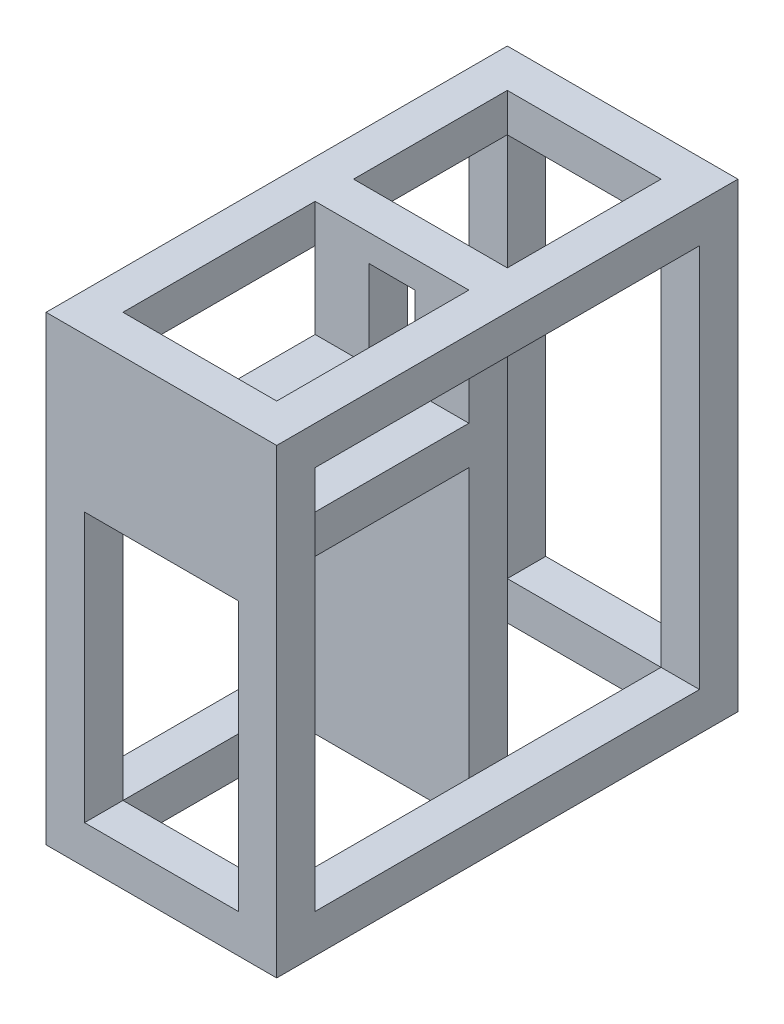
ISO-10303-21;
HEADER;
FILE_DESCRIPTION(('STEP AP214'),'2;1');
FILE_NAME('part.step','',(''),(''),'','','');
FILE_SCHEMA(('AUTOMOTIVE_DESIGN { 1 0 10303 214 1 1 1 1 }'));
ENDSEC;
DATA;
#1=APPLICATION_CONTEXT('core data for automotive mechanical design processes');
#2=APPLICATION_PROTOCOL_DEFINITION('international standard','automotive_design',2000,#1);
#3=PRODUCT_CONTEXT('',#1,'mechanical');
#4=PRODUCT('Part','Part','',(#3));
#5=PRODUCT_RELATED_PRODUCT_CATEGORY('part','',(#4));
#6=PRODUCT_DEFINITION_FORMATION('','',#4);
#7=PRODUCT_DEFINITION_CONTEXT('part definition',#1,'design');
#8=PRODUCT_DEFINITION('design','',#6,#7);
#9=PRODUCT_DEFINITION_SHAPE('','',#8);
#10=(LENGTH_UNIT() NAMED_UNIT(*) SI_UNIT(.MILLI.,.METRE.));
#11=(NAMED_UNIT(*) PLANE_ANGLE_UNIT() SI_UNIT($,.RADIAN.));
#12=(NAMED_UNIT(*) SI_UNIT($,.STERADIAN.) SOLID_ANGLE_UNIT());
#13=UNCERTAINTY_MEASURE_WITH_UNIT(LENGTH_MEASURE(1.E-05),#10,'distance_accuracy_value','');
#14=(GEOMETRIC_REPRESENTATION_CONTEXT(3) GLOBAL_UNCERTAINTY_ASSIGNED_CONTEXT((#13)) GLOBAL_UNIT_ASSIGNED_CONTEXT((#10,
#11,#12)) REPRESENTATION_CONTEXT('',''));
#15=CARTESIAN_POINT('',(0.,0.,0.));
#16=DIRECTION('',(0.,0.,1.));
#17=DIRECTION('',(1.,0.,0.));
#18=AXIS2_PLACEMENT_3D('',#15,#16,#17);
#19=CARTESIAN_POINT('',(50.8,304.8,-127.));
#20=DIRECTION('',(-1.,0.,0.));
#21=DIRECTION('',(0.,0.,1.));
#22=AXIS2_PLACEMENT_3D('',#19,#20,#21);
#23=PLANE('',#22);
#24=DIRECTION('',(0.,-1.,0.));
#25=VECTOR('',#24,1.);
#26=CARTESIAN_POINT('',(50.8,279.4,152.4));
#27=LINE('',#26,#25);
#28=CARTESIAN_POINT('',(50.8,203.2,152.4));
#29=VERTEX_POINT('',#28);
#30=CARTESIAN_POINT('',(50.8,25.4,152.4));
#31=VERTEX_POINT('',#30);
#32=EDGE_CURVE('E422',#29,#31,#27,.T.);
#33=ORIENTED_EDGE('',*,*,#32,.F.);
#34=DIRECTION('',(0.,0.,-1.));
#35=VECTOR('',#34,1.);
#36=CARTESIAN_POINT('',(50.8,203.2,152.4));
#37=LINE('',#36,#35);
#38=CARTESIAN_POINT('',(50.8,203.2,127.));
#39=VERTEX_POINT('',#38);
#40=EDGE_CURVE('E550',#29,#39,#37,.T.);
#41=ORIENTED_EDGE('',*,*,#40,.T.);
#42=DIRECTION('',(0.,1.,0.));
#43=VECTOR('',#42,1.);
#44=CARTESIAN_POINT('',(50.8,304.8,127.));
#45=LINE('',#44,#43);
#46=CARTESIAN_POINT('',(50.8,25.4,127.));
#47=VERTEX_POINT('',#46);
#48=EDGE_CURVE('E390',#47,#39,#45,.T.);
#49=ORIENTED_EDGE('',*,*,#48,.F.);
#50=DIRECTION('',(0.,0.,1.));
#51=VECTOR('',#50,1.);
#52=CARTESIAN_POINT('',(50.8,25.4,-152.4));
#53=LINE('',#52,#51);
#54=EDGE_CURVE('E419',#47,#31,#53,.T.);
#55=ORIENTED_EDGE('',*,*,#54,.T.);
#56=EDGE_LOOP('',(#33,#41,#49,#55));
#57=FACE_BOUND('',#56,.T.);
#58=ADVANCED_FACE('F44',(#57),#23,.T.);
#59=CARTESIAN_POINT('',(-50.8,304.8,-127.));
#60=DIRECTION('',(1.,0.,0.));
#61=DIRECTION('',(0.,0.,-1.));
#62=AXIS2_PLACEMENT_3D('',#59,#60,#61);
#63=PLANE('',#62);
#64=DIRECTION('',(0.,-1.,0.));
#65=VECTOR('',#64,1.);
#66=CARTESIAN_POINT('',(-50.8,304.8,127.));
#67=LINE('',#66,#65);
#68=CARTESIAN_POINT('',(-50.8,203.2,127.));
#69=VERTEX_POINT('',#68);
#70=CARTESIAN_POINT('',(-50.8,25.4,127.));
#71=VERTEX_POINT('',#70);
#72=EDGE_CURVE('E388',#69,#71,#67,.T.);
#73=ORIENTED_EDGE('',*,*,#72,.F.);
#74=DIRECTION('',(0.,0.,-1.));
#75=VECTOR('',#74,1.);
#76=CARTESIAN_POINT('',(-50.8,203.2,152.4));
#77=LINE('',#76,#75);
#78=CARTESIAN_POINT('',(-50.8,203.2,152.4));
#79=VERTEX_POINT('',#78);
#80=EDGE_CURVE('E305',#79,#69,#77,.T.);
#81=ORIENTED_EDGE('',*,*,#80,.F.);
#82=DIRECTION('',(0.,-1.,0.));
#83=VECTOR('',#82,1.);
#84=CARTESIAN_POINT('',(-50.8,279.4,152.4));
#85=LINE('',#84,#83);
#86=CARTESIAN_POINT('',(-50.8,25.4,152.4));
#87=VERTEX_POINT('',#86);
#88=EDGE_CURVE('E411',#79,#87,#85,.T.);
#89=ORIENTED_EDGE('',*,*,#88,.T.);
#90=DIRECTION('',(0.,0.,1.));
#91=VECTOR('',#90,1.);
#92=CARTESIAN_POINT('',(-50.8,25.4,-152.4));
#93=LINE('',#92,#91);
#94=EDGE_CURVE('E429',#71,#87,#93,.T.);
#95=ORIENTED_EDGE('',*,*,#94,.F.);
#96=EDGE_LOOP('',(#73,#81,#89,#95));
#97=FACE_BOUND('',#96,.T.);
#98=ADVANCED_FACE('F593',(#97),#63,.T.);
#99=CARTESIAN_POINT('',(0.,304.8,0.));
#100=DIRECTION('',(0.,0.,1.));
#101=DIRECTION('',(1.,0.,0.));
#102=AXIS2_PLACEMENT_3D('',#99,#100,#101);
#103=PLANE('',#102);
#104=DIRECTION('',(0.,1.,0.));
#105=VECTOR('',#104,1.);
#106=CARTESIAN_POINT('',(15.24,287.02,0.));
#107=LINE('',#106,#105);
#108=CARTESIAN_POINT('',(15.24,228.6,0.));
#109=VERTEX_POINT('',#108);
#110=CARTESIAN_POINT('',(15.24,287.02,0.));
#111=VERTEX_POINT('',#110);
#112=EDGE_CURVE('E288',#109,#111,#107,.T.);
#113=ORIENTED_EDGE('',*,*,#112,.F.);
#114=DIRECTION('',(-1.,0.,0.));
#115=VECTOR('',#114,1.);
#116=CARTESIAN_POINT('',(-50.8,228.6,0.));
#117=LINE('',#116,#115);
#118=CARTESIAN_POINT('',(50.8,228.6,0.));
#119=VERTEX_POINT('',#118);
#120=EDGE_CURVE('E547',#119,#109,#117,.T.);
#121=ORIENTED_EDGE('',*,*,#120,.F.);
#122=DIRECTION('',(0.,-1.,0.));
#123=VECTOR('',#122,1.);
#124=CARTESIAN_POINT('',(50.8,304.8,0.));
#125=LINE('',#124,#123);
#126=CARTESIAN_POINT('',(50.8,279.4,0.));
#127=VERTEX_POINT('',#126);
#128=EDGE_CURVE('E336',#127,#119,#125,.T.);
#129=ORIENTED_EDGE('',*,*,#128,.F.);
#130=CARTESIAN_POINT('',(50.8,304.8,0.));
#131=VERTEX_POINT('',#130);
#132=EDGE_CURVE('E332',#131,#127,#125,.T.);
#133=ORIENTED_EDGE('',*,*,#132,.F.);
#134=DIRECTION('',(-1.,0.,0.));
#135=VECTOR('',#134,1.);
#136=CARTESIAN_POINT('',(0.,304.8,0.));
#137=LINE('',#136,#135);
#138=CARTESIAN_POINT('',(-50.8,304.8,0.));
#139=VERTEX_POINT('',#138);
#140=EDGE_CURVE('E315',#131,#139,#137,.T.);
#141=ORIENTED_EDGE('',*,*,#140,.T.);
#142=DIRECTION('',(0.,-1.,0.));
#143=VECTOR('',#142,1.);
#144=CARTESIAN_POINT('',(-50.8,304.8,0.));
#145=LINE('',#144,#143);
#146=CARTESIAN_POINT('',(-50.8,279.4,0.));
#147=VERTEX_POINT('',#146);
#148=EDGE_CURVE('E328',#139,#147,#145,.T.);
#149=ORIENTED_EDGE('',*,*,#148,.T.);
#150=CARTESIAN_POINT('',(-50.8,228.6,0.));
#151=VERTEX_POINT('',#150);
#152=EDGE_CURVE('E330',#147,#151,#145,.T.);
#153=ORIENTED_EDGE('',*,*,#152,.T.);
#154=CARTESIAN_POINT('',(-15.24,228.6,0.));
#155=VERTEX_POINT('',#154);
#156=EDGE_CURVE('E304',#155,#151,#117,.T.);
#157=ORIENTED_EDGE('',*,*,#156,.F.);
#158=DIRECTION('',(0.,-1.,0.));
#159=VECTOR('',#158,1.);
#160=CARTESIAN_POINT('',(-15.24,287.02,0.));
#161=LINE('',#160,#159);
#162=CARTESIAN_POINT('',(-15.24,287.02,0.));
#163=VERTEX_POINT('',#162);
#164=EDGE_CURVE('E66',#163,#155,#161,.T.);
#165=ORIENTED_EDGE('',*,*,#164,.F.);
#166=DIRECTION('',(-1.,0.,0.));
#167=VECTOR('',#166,1.);
#168=CARTESIAN_POINT('',(-15.24,287.02,0.));
#169=LINE('',#168,#167);
#170=EDGE_CURVE('E1268',#111,#163,#169,.T.);
#171=ORIENTED_EDGE('',*,*,#170,.F.);
#172=EDGE_LOOP('',(#113,#121,#129,#133,#141,#149,#153,#157,#165,#171));
#173=FACE_BOUND('',#172,.T.);
#174=ADVANCED_FACE('F676',(#173),#103,.T.);
#175=CARTESIAN_POINT('',(50.8,203.2,0.));
#176=VERTEX_POINT('',#175);
#177=CARTESIAN_POINT('',(50.8,25.4000000000001,0.));
#178=VERTEX_POINT('',#177);
#179=EDGE_CURVE('E337',#176,#178,#125,.T.);
#180=ORIENTED_EDGE('',*,*,#179,.F.);
#181=DIRECTION('',(1.,0.,0.));
#182=VECTOR('',#181,1.);
#183=CARTESIAN_POINT('',(-50.8,203.2,0.));
#184=LINE('',#183,#182);
#185=CARTESIAN_POINT('',(-50.8,203.2,0.));
#186=VERTEX_POINT('',#185);
#187=EDGE_CURVE('E546',#186,#176,#184,.T.);
#188=ORIENTED_EDGE('',*,*,#187,.F.);
#189=CARTESIAN_POINT('',(-50.8,25.4000000000001,0.));
#190=VERTEX_POINT('',#189);
#191=EDGE_CURVE('E331',#186,#190,#145,.T.);
#192=ORIENTED_EDGE('',*,*,#191,.T.);
#193=CARTESIAN_POINT('',(-50.8,0.,0.));
#194=VERTEX_POINT('',#193);
#195=EDGE_CURVE('E335',#190,#194,#145,.T.);
#196=ORIENTED_EDGE('',*,*,#195,.T.);
#197=DIRECTION('',(-1.,0.,0.));
#198=VECTOR('',#197,1.);
#199=CARTESIAN_POINT('',(0.,0.,0.));
#200=LINE('',#199,#198);
#201=CARTESIAN_POINT('',(50.8,0.,0.));
#202=VERTEX_POINT('',#201);
#203=EDGE_CURVE('E316',#202,#194,#200,.T.);
#204=ORIENTED_EDGE('',*,*,#203,.F.);
#205=EDGE_CURVE('E340',#178,#202,#125,.T.);
#206=ORIENTED_EDGE('',*,*,#205,.F.);
#207=EDGE_LOOP('',(#180,#188,#192,#196,#204,#206));
#208=FACE_BOUND('',#207,.T.);
#209=ADVANCED_FACE('F566',(#208),#103,.T.);
#210=DIRECTION('',(0.,0.,-1.));
#211=VECTOR('',#210,1.);
#212=CARTESIAN_POINT('',(50.8,0.,-127.));
#213=LINE('',#212,#211);
#214=CARTESIAN_POINT('',(50.8,0.,-25.4));
#215=VERTEX_POINT('',#214);
#216=CARTESIAN_POINT('',(50.8,0.,-127.));
#217=VERTEX_POINT('',#216);
#218=EDGE_CURVE('E444',#215,#217,#213,.T.);
#219=ORIENTED_EDGE('',*,*,#218,.F.);
#220=DIRECTION('',(0.,-1.,0.));
#221=VECTOR('',#220,1.);
#222=CARTESIAN_POINT('',(50.8,304.8,-25.4));
#223=LINE('',#222,#221);
#224=CARTESIAN_POINT('',(50.8,25.4000000000001,-25.4));
#225=VERTEX_POINT('',#224);
#226=EDGE_CURVE('E318',#225,#215,#223,.T.);
#227=ORIENTED_EDGE('',*,*,#226,.F.);
#228=DIRECTION('',(0.,0.,1.));
#229=VECTOR('',#228,1.);
#230=CARTESIAN_POINT('',(50.8,25.4000000000001,-127.));
#231=LINE('',#230,#229);
#232=CARTESIAN_POINT('',(50.7999999999999,25.4,-127.));
#233=VERTEX_POINT('',#232);
#234=EDGE_CURVE('E398',#233,#225,#231,.T.);
#235=ORIENTED_EDGE('',*,*,#234,.F.);
#236=DIRECTION('',(0.,-1.,0.));
#237=VECTOR('',#236,1.);
#238=CARTESIAN_POINT('',(50.8,304.8,-127.));
#239=LINE('',#238,#237);
#240=EDGE_CURVE('E481',#233,#217,#239,.T.);
#241=ORIENTED_EDGE('',*,*,#240,.T.);
#242=EDGE_LOOP('',(#219,#227,#235,#241));
#243=FACE_BOUND('',#242,.T.);
#244=ADVANCED_FACE('F614',(#243),#23,.T.);
#245=DIRECTION('',(0.,0.,-1.));
#246=VECTOR('',#245,1.);
#247=CARTESIAN_POINT('',(-50.8,25.4000000000001,-127.));
#248=LINE('',#247,#246);
#249=CARTESIAN_POINT('',(-50.8,25.4000000000001,-25.4));
#250=VERTEX_POINT('',#249);
#251=CARTESIAN_POINT('',(-50.8,25.4,-127.));
#252=VERTEX_POINT('',#251);
#253=EDGE_CURVE('E392',#250,#252,#248,.T.);
#254=ORIENTED_EDGE('',*,*,#253,.F.);
#255=DIRECTION('',(0.,-1.,0.));
#256=VECTOR('',#255,1.);
#257=CARTESIAN_POINT('',(-50.8,304.8,-25.4));
#258=LINE('',#257,#256);
#259=CARTESIAN_POINT('',(-50.8,0.,-25.4));
#260=VERTEX_POINT('',#259);
#261=EDGE_CURVE('E327',#250,#260,#258,.T.);
#262=ORIENTED_EDGE('',*,*,#261,.T.);
#263=DIRECTION('',(0.,0.,1.));
#264=VECTOR('',#263,1.);
#265=CARTESIAN_POINT('',(-50.8,0.,-127.));
#266=LINE('',#265,#264);
#267=CARTESIAN_POINT('',(-50.8,0.,-127.));
#268=VERTEX_POINT('',#267);
#269=EDGE_CURVE('E465',#268,#260,#266,.T.);
#270=ORIENTED_EDGE('',*,*,#269,.F.);
#271=DIRECTION('',(0.,-1.,0.));
#272=VECTOR('',#271,1.);
#273=CARTESIAN_POINT('',(-50.8,304.8,-127.));
#274=LINE('',#273,#272);
#275=EDGE_CURVE('E477',#252,#268,#274,.T.);
#276=ORIENTED_EDGE('',*,*,#275,.F.);
#277=EDGE_LOOP('',(#254,#262,#270,#276));
#278=FACE_BOUND('',#277,.T.);
#279=ADVANCED_FACE('F625',(#278),#63,.T.);
#280=DIRECTION('',(0.,0.,-1.));
#281=VECTOR('',#280,1.);
#282=CARTESIAN_POINT('',(50.8,279.4,-127.));
#283=LINE('',#282,#281);
#284=CARTESIAN_POINT('',(50.8,279.4,-25.4));
#285=VERTEX_POINT('',#284);
#286=CARTESIAN_POINT('',(50.7999999999999,279.4,-127.));
#287=VERTEX_POINT('',#286);
#288=EDGE_CURVE('E401',#285,#287,#283,.T.);
#289=ORIENTED_EDGE('',*,*,#288,.F.);
#290=CARTESIAN_POINT('',(50.8,304.8,-25.4));
#291=VERTEX_POINT('',#290);
#292=EDGE_CURVE('E338',#291,#285,#223,.T.);
#293=ORIENTED_EDGE('',*,*,#292,.F.);
#294=DIRECTION('',(0.,0.,-1.));
#295=VECTOR('',#294,1.);
#296=CARTESIAN_POINT('',(50.8,304.8,-127.));
#297=LINE('',#296,#295);
#298=CARTESIAN_POINT('',(50.8,304.8,-127.));
#299=VERTEX_POINT('',#298);
#300=EDGE_CURVE('E449',#291,#299,#297,.T.);
#301=ORIENTED_EDGE('',*,*,#300,.T.);
#302=EDGE_CURVE('E482',#299,#287,#239,.T.);
#303=ORIENTED_EDGE('',*,*,#302,.T.);
#304=EDGE_LOOP('',(#289,#293,#301,#303));
#305=FACE_BOUND('',#304,.T.);
#306=ADVANCED_FACE('F679',(#305),#23,.T.);
#307=DIRECTION('',(0.,0.,1.));
#308=VECTOR('',#307,1.);
#309=CARTESIAN_POINT('',(-50.8,304.8,-127.));
#310=LINE('',#309,#308);
#311=CARTESIAN_POINT('',(-50.8,304.8,-127.));
#312=VERTEX_POINT('',#311);
#313=CARTESIAN_POINT('',(-50.8,304.8,-25.4));
#314=VERTEX_POINT('',#313);
#315=EDGE_CURVE('E452',#312,#314,#310,.T.);
#316=ORIENTED_EDGE('',*,*,#315,.T.);
#317=CARTESIAN_POINT('',(-50.8,279.4,-25.4));
#318=VERTEX_POINT('',#317);
#319=EDGE_CURVE('E322',#314,#318,#258,.T.);
#320=ORIENTED_EDGE('',*,*,#319,.T.);
#321=DIRECTION('',(0.,0.,1.));
#322=VECTOR('',#321,1.);
#323=CARTESIAN_POINT('',(-50.8,279.4,-127.));
#324=LINE('',#323,#322);
#325=CARTESIAN_POINT('',(-50.8,279.4,-127.));
#326=VERTEX_POINT('',#325);
#327=EDGE_CURVE('E519',#326,#318,#324,.T.);
#328=ORIENTED_EDGE('',*,*,#327,.F.);
#329=EDGE_CURVE('E478',#312,#326,#274,.T.);
#330=ORIENTED_EDGE('',*,*,#329,.F.);
#331=EDGE_LOOP('',(#316,#320,#328,#330));
#332=FACE_BOUND('',#331,.T.);
#333=ADVANCED_FACE('F634',(#332),#63,.T.);
#334=DIRECTION('',(0.,-1.,0.));
#335=VECTOR('',#334,1.);
#336=CARTESIAN_POINT('',(50.8,304.8,-127.));
#337=LINE('',#336,#335);
#338=EDGE_CURVE('E386',#287,#233,#337,.T.);
#339=ORIENTED_EDGE('',*,*,#338,.F.);
#340=DIRECTION('',(0.,0.,1.));
#341=VECTOR('',#340,1.);
#342=CARTESIAN_POINT('',(50.8,279.4,-152.4));
#343=LINE('',#342,#341);
#344=CARTESIAN_POINT('',(50.7999999999999,279.4,-152.4));
#345=VERTEX_POINT('',#344);
#346=EDGE_CURVE('E433',#345,#287,#343,.T.);
#347=ORIENTED_EDGE('',*,*,#346,.F.);
#348=DIRECTION('',(0.,-1.,0.));
#349=VECTOR('',#348,1.);
#350=CARTESIAN_POINT('',(50.8,279.4,-152.4));
#351=LINE('',#350,#349);
#352=CARTESIAN_POINT('',(50.8,25.4,-152.4));
#353=VERTEX_POINT('',#352);
#354=EDGE_CURVE('E410',#345,#353,#351,.T.);
#355=ORIENTED_EDGE('',*,*,#354,.T.);
#356=EDGE_CURVE('E436',#353,#233,#53,.T.);
#357=ORIENTED_EDGE('',*,*,#356,.T.);
#358=EDGE_LOOP('',(#339,#347,#355,#357));
#359=FACE_BOUND('',#358,.T.);
#360=ADVANCED_FACE('F687',(#359),#23,.T.);
#361=ORIENTED_EDGE('',*,*,#205,.T.);
#362=CARTESIAN_POINT('',(50.8,0.,127.));
#363=VERTEX_POINT('',#362);
#364=EDGE_CURVE('E458',#363,#202,#213,.T.);
#365=ORIENTED_EDGE('',*,*,#364,.F.);
#366=DIRECTION('',(0.,-1.,0.));
#367=VECTOR('',#366,1.);
#368=CARTESIAN_POINT('',(50.8,304.8,127.));
#369=LINE('',#368,#367);
#370=EDGE_CURVE('E457',#47,#363,#369,.T.);
#371=ORIENTED_EDGE('',*,*,#370,.F.);
#372=EDGE_CURVE('E396',#178,#47,#231,.T.);
#373=ORIENTED_EDGE('',*,*,#372,.F.);
#374=EDGE_LOOP('',(#361,#365,#371,#373));
#375=FACE_BOUND('',#374,.T.);
#376=ADVANCED_FACE('F572',(#375),#23,.T.);
#377=DIRECTION('',(0.,1.,0.));
#378=VECTOR('',#377,1.);
#379=CARTESIAN_POINT('',(-50.8,304.8,-127.));
#380=LINE('',#379,#378);
#381=EDGE_CURVE('E372',#252,#326,#380,.T.);
#382=ORIENTED_EDGE('',*,*,#381,.F.);
#383=CARTESIAN_POINT('',(-50.8,25.4,-152.4));
#384=VERTEX_POINT('',#383);
#385=EDGE_CURVE('E425',#384,#252,#93,.T.);
#386=ORIENTED_EDGE('',*,*,#385,.F.);
#387=DIRECTION('',(0.,-1.,0.));
#388=VECTOR('',#387,1.);
#389=CARTESIAN_POINT('',(-50.8,279.4,-152.4));
#390=LINE('',#389,#388);
#391=CARTESIAN_POINT('',(-50.8,279.4,-152.4));
#392=VERTEX_POINT('',#391);
#393=EDGE_CURVE('E416',#392,#384,#390,.T.);
#394=ORIENTED_EDGE('',*,*,#393,.F.);
#395=DIRECTION('',(0.,0.,1.));
#396=VECTOR('',#395,1.);
#397=CARTESIAN_POINT('',(-50.8,279.4,-152.4));
#398=LINE('',#397,#396);
#399=EDGE_CURVE('E430',#392,#326,#398,.T.);
#400=ORIENTED_EDGE('',*,*,#399,.T.);
#401=EDGE_LOOP('',(#382,#386,#394,#400));
#402=FACE_BOUND('',#401,.T.);
#403=ADVANCED_FACE('F647',(#402),#63,.T.);
#404=ORIENTED_EDGE('',*,*,#195,.F.);
#405=EDGE_CURVE('E393',#71,#190,#248,.T.);
#406=ORIENTED_EDGE('',*,*,#405,.F.);
#407=DIRECTION('',(0.,-1.,0.));
#408=VECTOR('',#407,1.);
#409=CARTESIAN_POINT('',(-50.8,304.8,127.));
#410=LINE('',#409,#408);
#411=CARTESIAN_POINT('',(-50.8,0.,127.));
#412=VERTEX_POINT('',#411);
#413=EDGE_CURVE('E473',#71,#412,#410,.T.);
#414=ORIENTED_EDGE('',*,*,#413,.T.);
#415=EDGE_CURVE('E464',#194,#412,#266,.T.);
#416=ORIENTED_EDGE('',*,*,#415,.F.);
#417=EDGE_LOOP('',(#404,#406,#414,#416));
#418=FACE_BOUND('',#417,.T.);
#419=ADVANCED_FACE('F667',(#418),#63,.T.);
#420=CARTESIAN_POINT('',(-50.8,304.8,-127.));
#421=DIRECTION('',(0.,0.,1.));
#422=DIRECTION('',(1.,0.,0.));
#423=AXIS2_PLACEMENT_3D('',#420,#421,#422);
#424=PLANE('',#423);
#425=ORIENTED_EDGE('',*,*,#329,.T.);
#426=DIRECTION('',(1.,0.,0.));
#427=VECTOR('',#426,1.);
#428=CARTESIAN_POINT('',(-50.8,279.4,-127.));
#429=LINE('',#428,#427);
#430=EDGE_CURVE('E428',#326,#287,#429,.T.);
#431=ORIENTED_EDGE('',*,*,#430,.T.);
#432=ORIENTED_EDGE('',*,*,#302,.F.);
#433=DIRECTION('',(-1.,0.,0.));
#434=VECTOR('',#433,1.);
#435=CARTESIAN_POINT('',(-50.8,304.8,-127.));
#436=LINE('',#435,#434);
#437=EDGE_CURVE('E448',#299,#312,#436,.T.);
#438=ORIENTED_EDGE('',*,*,#437,.T.);
#439=EDGE_LOOP('',(#425,#431,#432,#438));
#440=FACE_BOUND('',#439,.T.);
#441=ADVANCED_FACE('F660',(#440),#424,.T.);
#442=CARTESIAN_POINT('',(-50.8,304.8,127.));
#443=DIRECTION('',(0.,0.,-1.));
#444=DIRECTION('',(-1.,0.,0.));
#445=AXIS2_PLACEMENT_3D('',#442,#443,#444);
#446=PLANE('',#445);
#447=CARTESIAN_POINT('',(50.8,304.8,127.));
#448=VERTEX_POINT('',#447);
#449=CARTESIAN_POINT('',(50.8,279.4,127.));
#450=VERTEX_POINT('',#449);
#451=EDGE_CURVE('E471',#448,#450,#369,.T.);
#452=ORIENTED_EDGE('',*,*,#451,.T.);
#453=DIRECTION('',(1.,0.,0.));
#454=VECTOR('',#453,1.);
#455=CARTESIAN_POINT('',(-76.2,279.4,127.));
#456=LINE('',#455,#454);
#457=CARTESIAN_POINT('',(76.2,279.4,127.));
#458=VERTEX_POINT('',#457);
#459=EDGE_CURVE('E381',#450,#458,#456,.T.);
#460=ORIENTED_EDGE('',*,*,#459,.T.);
#461=DIRECTION('',(0.,-1.,0.));
#462=VECTOR('',#461,1.);
#463=CARTESIAN_POINT('',(76.2,279.4,127.));
#464=LINE('',#463,#462);
#465=CARTESIAN_POINT('',(76.2,25.4,127.));
#466=VERTEX_POINT('',#465);
#467=EDGE_CURVE('E364',#458,#466,#464,.T.);
#468=ORIENTED_EDGE('',*,*,#467,.T.);
#469=DIRECTION('',(1.,0.,0.));
#470=VECTOR('',#469,1.);
#471=CARTESIAN_POINT('',(-76.2,25.4,127.));
#472=LINE('',#471,#470);
#473=EDGE_CURVE('E377',#47,#466,#472,.T.);
#474=ORIENTED_EDGE('',*,*,#473,.F.);
#475=ORIENTED_EDGE('',*,*,#48,.T.);
#476=DIRECTION('',(0.,-1.,0.));
#477=VECTOR('',#476,1.);
#478=CARTESIAN_POINT('',(50.7999999999999,279.4,127.));
#479=LINE('',#478,#477);
#480=CARTESIAN_POINT('',(50.8,228.6,127.));
#481=VERTEX_POINT('',#480);
#482=EDGE_CURVE('E284',#481,#39,#479,.T.);
#483=ORIENTED_EDGE('',*,*,#482,.F.);
#484=DIRECTION('',(1.,0.,0.));
#485=VECTOR('',#484,1.);
#486=CARTESIAN_POINT('',(50.8,228.6,127.));
#487=LINE('',#486,#485);
#488=CARTESIAN_POINT('',(-50.8,228.6,127.));
#489=VERTEX_POINT('',#488);
#490=EDGE_CURVE('E278',#489,#481,#487,.T.);
#491=ORIENTED_EDGE('',*,*,#490,.F.);
#492=DIRECTION('',(0.,1.,0.));
#493=VECTOR('',#492,1.);
#494=CARTESIAN_POINT('',(-50.8,279.4,127.));
#495=LINE('',#494,#493);
#496=EDGE_CURVE('E282',#69,#489,#495,.T.);
#497=ORIENTED_EDGE('',*,*,#496,.F.);
#498=ORIENTED_EDGE('',*,*,#72,.T.);
#499=CARTESIAN_POINT('',(-76.2,25.4,127.));
#500=VERTEX_POINT('',#499);
#501=EDGE_CURVE('E374',#500,#71,#472,.T.);
#502=ORIENTED_EDGE('',*,*,#501,.F.);
#503=DIRECTION('',(0.,-1.,0.));
#504=VECTOR('',#503,1.);
#505=CARTESIAN_POINT('',(-76.2,279.4,127.));
#506=LINE('',#505,#504);
#507=CARTESIAN_POINT('',(-76.1999999999999,279.4,127.));
#508=VERTEX_POINT('',#507);
#509=EDGE_CURVE('E353',#508,#500,#506,.T.);
#510=ORIENTED_EDGE('',*,*,#509,.F.);
#511=CARTESIAN_POINT('',(-50.8,279.4,127.));
#512=VERTEX_POINT('',#511);
#513=EDGE_CURVE('E378',#508,#512,#456,.T.);
#514=ORIENTED_EDGE('',*,*,#513,.T.);
#515=CARTESIAN_POINT('',(-50.8,304.8,127.));
#516=VERTEX_POINT('',#515);
#517=EDGE_CURVE('E474',#516,#512,#410,.T.);
#518=ORIENTED_EDGE('',*,*,#517,.F.);
#519=DIRECTION('',(1.,0.,0.));
#520=VECTOR('',#519,1.);
#521=CARTESIAN_POINT('',(-50.8,304.8,127.));
#522=LINE('',#521,#520);
#523=EDGE_CURVE('E455',#516,#448,#522,.T.);
#524=ORIENTED_EDGE('',*,*,#523,.T.);
#525=EDGE_LOOP('',(#452,#460,#468,#474,#475,#483,#491,#497,#498,#502,#510,#514,#518,#524));
#526=FACE_BOUND('',#525,.T.);
#527=ADVANCED_FACE('F281',(#526),#446,.T.);
#528=CARTESIAN_POINT('',(0.,304.8,0.));
#529=DIRECTION('',(0.,1.,0.));
#530=DIRECTION('',(0.,0.,1.));
#531=AXIS2_PLACEMENT_3D('',#528,#529,#530);
#532=PLANE('',#531);
#533=ORIENTED_EDGE('',*,*,#300,.F.);
#534=DIRECTION('',(-1.,0.,0.));
#535=VECTOR('',#534,1.);
#536=CARTESIAN_POINT('',(0.,304.8,-25.4));
#537=LINE('',#536,#535);
#538=EDGE_CURVE('E313',#291,#314,#537,.T.);
#539=ORIENTED_EDGE('',*,*,#538,.T.);
#540=ORIENTED_EDGE('',*,*,#315,.F.);
#541=ORIENTED_EDGE('',*,*,#437,.F.);
#542=EDGE_LOOP('',(#533,#539,#540,#541));
#543=FACE_BOUND('',#542,.T.);
#544=DIRECTION('',(0.,0.,-1.));
#545=VECTOR('',#544,1.);
#546=CARTESIAN_POINT('',(76.2,304.8,-152.4));
#547=LINE('',#546,#545);
#548=CARTESIAN_POINT('',(76.2,304.8,152.4));
#549=VERTEX_POINT('',#548);
#550=CARTESIAN_POINT('',(76.2,304.8,-152.4));
#551=VERTEX_POINT('',#550);
#552=EDGE_CURVE('E486',#549,#551,#547,.T.);
#553=ORIENTED_EDGE('',*,*,#552,.T.);
#554=DIRECTION('',(-1.,0.,0.));
#555=VECTOR('',#554,1.);
#556=CARTESIAN_POINT('',(-76.2,304.8,-152.4));
#557=LINE('',#556,#555);
#558=CARTESIAN_POINT('',(-76.2,304.8,-152.4));
#559=VERTEX_POINT('',#558);
#560=EDGE_CURVE('E489',#551,#559,#557,.T.);
#561=ORIENTED_EDGE('',*,*,#560,.T.);
#562=DIRECTION('',(0.,0.,1.));
#563=VECTOR('',#562,1.);
#564=CARTESIAN_POINT('',(-76.2,304.8,-152.4));
#565=LINE('',#564,#563);
#566=CARTESIAN_POINT('',(-76.1999999999999,304.8,152.4));
#567=VERTEX_POINT('',#566);
#568=EDGE_CURVE('E492',#559,#567,#565,.T.);
#569=ORIENTED_EDGE('',*,*,#568,.T.);
#570=DIRECTION('',(1.,0.,0.));
#571=VECTOR('',#570,1.);
#572=CARTESIAN_POINT('',(-76.1999999999999,304.8,152.4));
#573=LINE('',#572,#571);
#574=EDGE_CURVE('E494',#567,#549,#573,.T.);
#575=ORIENTED_EDGE('',*,*,#574,.T.);
#576=EDGE_LOOP('',(#553,#561,#569,#575));
#577=FACE_BOUND('',#576,.T.);
#578=ORIENTED_EDGE('',*,*,#140,.F.);
#579=EDGE_CURVE('E445',#448,#131,#297,.T.);
#580=ORIENTED_EDGE('',*,*,#579,.F.);
#581=ORIENTED_EDGE('',*,*,#523,.F.);
#582=EDGE_CURVE('E451',#139,#516,#310,.T.);
#583=ORIENTED_EDGE('',*,*,#582,.F.);
#584=EDGE_LOOP('',(#578,#580,#581,#583));
#585=FACE_BOUND('',#584,.T.);
#586=ADVANCED_FACE('F708',(#543,#577,#585),#532,.T.);
#587=CARTESIAN_POINT('',(0.,0.,0.));
#588=DIRECTION('',(0.,1.,0.));
#589=DIRECTION('',(0.,0.,1.));
#590=AXIS2_PLACEMENT_3D('',#587,#588,#589);
#591=PLANE('',#590);
#592=ORIENTED_EDGE('',*,*,#203,.T.);
#593=ORIENTED_EDGE('',*,*,#415,.T.);
#594=DIRECTION('',(1.,0.,0.));
#595=VECTOR('',#594,1.);
#596=CARTESIAN_POINT('',(-50.8,0.,127.));
#597=LINE('',#596,#595);
#598=EDGE_CURVE('E468',#412,#363,#597,.T.);
#599=ORIENTED_EDGE('',*,*,#598,.T.);
#600=ORIENTED_EDGE('',*,*,#364,.T.);
#601=EDGE_LOOP('',(#592,#593,#599,#600));
#602=FACE_BOUND('',#601,.T.);
#603=DIRECTION('',(0.,0.,-1.));
#604=VECTOR('',#603,1.);
#605=CARTESIAN_POINT('',(76.2,0.,-152.4));
#606=LINE('',#605,#604);
#607=CARTESIAN_POINT('',(76.2,0.,152.4));
#608=VERTEX_POINT('',#607);
#609=CARTESIAN_POINT('',(76.2,0.,-152.4));
#610=VERTEX_POINT('',#609);
#611=EDGE_CURVE('E485',#608,#610,#606,.T.);
#612=ORIENTED_EDGE('',*,*,#611,.F.);
#613=DIRECTION('',(1.,0.,0.));
#614=VECTOR('',#613,1.);
#615=CARTESIAN_POINT('',(-76.1999999999999,0.,152.4));
#616=LINE('',#615,#614);
#617=CARTESIAN_POINT('',(-76.1999999999999,0.,152.4));
#618=VERTEX_POINT('',#617);
#619=EDGE_CURVE('E490',#618,#608,#616,.T.);
#620=ORIENTED_EDGE('',*,*,#619,.F.);
#621=DIRECTION('',(0.,0.,1.));
#622=VECTOR('',#621,1.);
#623=CARTESIAN_POINT('',(-76.2,0.,-152.4));
#624=LINE('',#623,#622);
#625=CARTESIAN_POINT('',(-76.2,0.,-152.4));
#626=VERTEX_POINT('',#625);
#627=EDGE_CURVE('E501',#626,#618,#624,.T.);
#628=ORIENTED_EDGE('',*,*,#627,.F.);
#629=DIRECTION('',(-1.,0.,0.));
#630=VECTOR('',#629,1.);
#631=CARTESIAN_POINT('',(-76.2,0.,-152.4));
#632=LINE('',#631,#630);
#633=EDGE_CURVE('E499',#610,#626,#632,.T.);
#634=ORIENTED_EDGE('',*,*,#633,.F.);
#635=EDGE_LOOP('',(#612,#620,#628,#634));
#636=FACE_BOUND('',#635,.T.);
#637=ORIENTED_EDGE('',*,*,#269,.T.);
#638=DIRECTION('',(-1.,0.,0.));
#639=VECTOR('',#638,1.);
#640=CARTESIAN_POINT('',(0.,0.,-25.4));
#641=LINE('',#640,#639);
#642=EDGE_CURVE('E312',#215,#260,#641,.T.);
#643=ORIENTED_EDGE('',*,*,#642,.F.);
#644=ORIENTED_EDGE('',*,*,#218,.T.);
#645=DIRECTION('',(-1.,0.,0.));
#646=VECTOR('',#645,1.);
#647=CARTESIAN_POINT('',(-50.8,0.,-127.));
#648=LINE('',#647,#646);
#649=EDGE_CURVE('E461',#217,#268,#648,.T.);
#650=ORIENTED_EDGE('',*,*,#649,.T.);
#651=EDGE_LOOP('',(#637,#643,#644,#650));
#652=FACE_BOUND('',#651,.T.);
#653=ADVANCED_FACE('F576',(#602,#636,#652),#591,.F.);
#654=CARTESIAN_POINT('',(76.2,304.8,-152.4));
#655=DIRECTION('',(-1.,0.,0.));
#656=DIRECTION('',(0.,0.,1.));
#657=AXIS2_PLACEMENT_3D('',#654,#655,#656);
#658=PLANE('',#657);
#659=DIRECTION('',(0.,0.,1.));
#660=VECTOR('',#659,1.);
#661=CARTESIAN_POINT('',(76.2,279.4,127.));
#662=LINE('',#661,#660);
#663=CARTESIAN_POINT('',(76.2,279.4,-127.));
#664=VERTEX_POINT('',#663);
#665=EDGE_CURVE('E361',#664,#458,#662,.T.);
#666=ORIENTED_EDGE('',*,*,#665,.F.);
#667=DIRECTION('',(0.,1.,0.));
#668=VECTOR('',#667,1.);
#669=CARTESIAN_POINT('',(76.2,279.4,-127.));
#670=LINE('',#669,#668);
#671=CARTESIAN_POINT('',(76.2,25.4,-127.));
#672=VERTEX_POINT('',#671);
#673=EDGE_CURVE('E345',#672,#664,#670,.T.);
#674=ORIENTED_EDGE('',*,*,#673,.F.);
#675=DIRECTION('',(0.,0.,-1.));
#676=VECTOR('',#675,1.);
#677=CARTESIAN_POINT('',(76.2,25.4,127.));
#678=LINE('',#677,#676);
#679=EDGE_CURVE('E350',#466,#672,#678,.T.);
#680=ORIENTED_EDGE('',*,*,#679,.F.);
#681=ORIENTED_EDGE('',*,*,#467,.F.);
#682=EDGE_LOOP('',(#666,#674,#680,#681));
#683=FACE_BOUND('',#682,.T.);
#684=ORIENTED_EDGE('',*,*,#611,.T.);
#685=DIRECTION('',(0.,-1.,0.));
#686=VECTOR('',#685,1.);
#687=CARTESIAN_POINT('',(76.2,304.8,-152.4));
#688=LINE('',#687,#686);
#689=EDGE_CURVE('E512',#551,#610,#688,.T.);
#690=ORIENTED_EDGE('',*,*,#689,.F.);
#691=ORIENTED_EDGE('',*,*,#552,.F.);
#692=DIRECTION('',(0.,-1.,0.));
#693=VECTOR('',#692,1.);
#694=CARTESIAN_POINT('',(76.2,304.8,152.4));
#695=LINE('',#694,#693);
#696=EDGE_CURVE('E496',#549,#608,#695,.T.);
#697=ORIENTED_EDGE('',*,*,#696,.T.);
#698=EDGE_LOOP('',(#684,#690,#691,#697));
#699=FACE_BOUND('',#698,.T.);
#700=ADVANCED_FACE('F46',(#683,#699),#658,.F.);
#701=CARTESIAN_POINT('',(-76.2,304.8,-152.4));
#702=DIRECTION('',(0.,0.,1.));
#703=DIRECTION('',(1.,0.,0.));
#704=AXIS2_PLACEMENT_3D('',#701,#702,#703);
#705=PLANE('',#704);
#706=ORIENTED_EDGE('',*,*,#393,.T.);
#707=DIRECTION('',(1.,0.,0.));
#708=VECTOR('',#707,1.);
#709=CARTESIAN_POINT('',(-50.8,25.4,-152.4));
#710=LINE('',#709,#708);
#711=EDGE_CURVE('E407',#384,#353,#710,.T.);
#712=ORIENTED_EDGE('',*,*,#711,.T.);
#713=ORIENTED_EDGE('',*,*,#354,.F.);
#714=DIRECTION('',(1.,0.,0.));
#715=VECTOR('',#714,1.);
#716=CARTESIAN_POINT('',(-50.8,279.4,-152.4));
#717=LINE('',#716,#715);
#718=EDGE_CURVE('E413',#392,#345,#717,.T.);
#719=ORIENTED_EDGE('',*,*,#718,.F.);
#720=EDGE_LOOP('',(#706,#712,#713,#719));
#721=FACE_BOUND('',#720,.T.);
#722=ORIENTED_EDGE('',*,*,#633,.T.);
#723=DIRECTION('',(0.,-1.,0.));
#724=VECTOR('',#723,1.);
#725=CARTESIAN_POINT('',(-76.2,304.8,-152.4));
#726=LINE('',#725,#724);
#727=EDGE_CURVE('E509',#559,#626,#726,.T.);
#728=ORIENTED_EDGE('',*,*,#727,.F.);
#729=ORIENTED_EDGE('',*,*,#560,.F.);
#730=ORIENTED_EDGE('',*,*,#689,.T.);
#731=EDGE_LOOP('',(#722,#728,#729,#730));
#732=FACE_BOUND('',#731,.T.);
#733=ADVANCED_FACE('F734',(#721,#732),#705,.F.);
#734=CARTESIAN_POINT('',(-76.2,304.8,-152.4));
#735=DIRECTION('',(1.,0.,0.));
#736=DIRECTION('',(0.,0.,-1.));
#737=AXIS2_PLACEMENT_3D('',#734,#735,#736);
#738=PLANE('',#737);
#739=DIRECTION('',(0.,0.,-1.));
#740=VECTOR('',#739,1.);
#741=CARTESIAN_POINT('',(-76.2,25.4,127.));
#742=LINE('',#741,#740);
#743=CARTESIAN_POINT('',(-76.2,25.4,-127.));
#744=VERTEX_POINT('',#743);
#745=EDGE_CURVE('E356',#500,#744,#742,.T.);
#746=ORIENTED_EDGE('',*,*,#745,.T.);
#747=DIRECTION('',(0.,1.,0.));
#748=VECTOR('',#747,1.);
#749=CARTESIAN_POINT('',(-76.2,279.4,-127.));
#750=LINE('',#749,#748);
#751=CARTESIAN_POINT('',(-76.2,279.4,-127.));
#752=VERTEX_POINT('',#751);
#753=EDGE_CURVE('E346',#744,#752,#750,.T.);
#754=ORIENTED_EDGE('',*,*,#753,.T.);
#755=DIRECTION('',(0.,0.,1.));
#756=VECTOR('',#755,1.);
#757=CARTESIAN_POINT('',(-76.2,279.4,127.));
#758=LINE('',#757,#756);
#759=EDGE_CURVE('E349',#752,#508,#758,.T.);
#760=ORIENTED_EDGE('',*,*,#759,.T.);
#761=ORIENTED_EDGE('',*,*,#509,.T.);
#762=EDGE_LOOP('',(#746,#754,#760,#761));
#763=FACE_BOUND('',#762,.T.);
#764=ORIENTED_EDGE('',*,*,#627,.T.);
#765=DIRECTION('',(0.,-1.,0.));
#766=VECTOR('',#765,1.);
#767=CARTESIAN_POINT('',(-76.1999999999999,304.8,152.4));
#768=LINE('',#767,#766);
#769=EDGE_CURVE('E506',#567,#618,#768,.T.);
#770=ORIENTED_EDGE('',*,*,#769,.F.);
#771=ORIENTED_EDGE('',*,*,#568,.F.);
#772=ORIENTED_EDGE('',*,*,#727,.T.);
#773=EDGE_LOOP('',(#764,#770,#771,#772));
#774=FACE_BOUND('',#773,.T.);
#775=ADVANCED_FACE('F731',(#763,#774),#738,.F.);
#776=CARTESIAN_POINT('',(-76.1999999999999,304.8,152.4));
#777=DIRECTION('',(0.,0.,-1.));
#778=DIRECTION('',(-1.,0.,0.));
#779=AXIS2_PLACEMENT_3D('',#776,#777,#778);
#780=PLANE('',#779);
#781=DIRECTION('',(1.,0.,0.));
#782=VECTOR('',#781,1.);
#783=CARTESIAN_POINT('',(-50.8,203.2,152.4));
#784=LINE('',#783,#782);
#785=EDGE_CURVE('E543',#79,#29,#784,.T.);
#786=ORIENTED_EDGE('',*,*,#785,.T.);
#787=ORIENTED_EDGE('',*,*,#32,.T.);
#788=DIRECTION('',(1.,0.,0.));
#789=VECTOR('',#788,1.);
#790=CARTESIAN_POINT('',(-50.8,25.4,152.4));
#791=LINE('',#790,#789);
#792=EDGE_CURVE('E406',#87,#31,#791,.T.);
#793=ORIENTED_EDGE('',*,*,#792,.F.);
#794=ORIENTED_EDGE('',*,*,#88,.F.);
#795=EDGE_LOOP('',(#786,#787,#793,#794));
#796=FACE_BOUND('',#795,.T.);
#797=ORIENTED_EDGE('',*,*,#619,.T.);
#798=ORIENTED_EDGE('',*,*,#696,.F.);
#799=ORIENTED_EDGE('',*,*,#574,.F.);
#800=ORIENTED_EDGE('',*,*,#769,.T.);
#801=EDGE_LOOP('',(#797,#798,#799,#800));
#802=FACE_BOUND('',#801,.T.);
#803=ADVANCED_FACE('F597',(#796,#802),#780,.F.);
#804=ORIENTED_EDGE('',*,*,#132,.T.);
#805=EDGE_CURVE('E403',#450,#127,#283,.T.);
#806=ORIENTED_EDGE('',*,*,#805,.F.);
#807=ORIENTED_EDGE('',*,*,#451,.F.);
#808=ORIENTED_EDGE('',*,*,#579,.T.);
#809=EDGE_LOOP('',(#804,#806,#807,#808));
#810=FACE_BOUND('',#809,.T.);
#811=ADVANCED_FACE('F658',(#810),#23,.T.);
#812=DIRECTION('',(1.,0.,0.));
#813=VECTOR('',#812,1.);
#814=CARTESIAN_POINT('',(-50.8,25.4,-127.));
#815=LINE('',#814,#813);
#816=EDGE_CURVE('E441',#252,#233,#815,.T.);
#817=ORIENTED_EDGE('',*,*,#816,.F.);
#818=ORIENTED_EDGE('',*,*,#275,.T.);
#819=ORIENTED_EDGE('',*,*,#649,.F.);
#820=ORIENTED_EDGE('',*,*,#240,.F.);
#821=EDGE_LOOP('',(#817,#818,#819,#820));
#822=FACE_BOUND('',#821,.T.);
#823=ADVANCED_FACE('F655',(#822),#424,.T.);
#824=ORIENTED_EDGE('',*,*,#148,.F.);
#825=ORIENTED_EDGE('',*,*,#582,.T.);
#826=ORIENTED_EDGE('',*,*,#517,.T.);
#827=EDGE_CURVE('E518',#147,#512,#324,.T.);
#828=ORIENTED_EDGE('',*,*,#827,.F.);
#829=EDGE_LOOP('',(#824,#825,#826,#828));
#830=FACE_BOUND('',#829,.T.);
#831=ADVANCED_FACE('F657',(#830),#63,.T.);
#832=DIRECTION('',(-1.,0.,0.));
#833=VECTOR('',#832,1.);
#834=CARTESIAN_POINT('',(-50.8,25.4,127.));
#835=LINE('',#834,#833);
#836=EDGE_CURVE('E515',#47,#71,#835,.T.);
#837=ORIENTED_EDGE('',*,*,#836,.F.);
#838=ORIENTED_EDGE('',*,*,#370,.T.);
#839=ORIENTED_EDGE('',*,*,#598,.F.);
#840=ORIENTED_EDGE('',*,*,#413,.F.);
#841=EDGE_LOOP('',(#837,#838,#839,#840));
#842=FACE_BOUND('',#841,.T.);
#843=ADVANCED_FACE('F584',(#842),#446,.T.);
#844=CARTESIAN_POINT('',(-50.8,25.4,-152.4));
#845=DIRECTION('',(0.,-1.,0.));
#846=DIRECTION('',(0.,0.,-1.));
#847=AXIS2_PLACEMENT_3D('',#844,#845,#846);
#848=PLANE('',#847);
#849=ORIENTED_EDGE('',*,*,#836,.T.);
#850=ORIENTED_EDGE('',*,*,#94,.T.);
#851=ORIENTED_EDGE('',*,*,#792,.T.);
#852=ORIENTED_EDGE('',*,*,#54,.F.);
#853=EDGE_LOOP('',(#849,#850,#851,#852));
#854=FACE_BOUND('',#853,.T.);
#855=ADVANCED_FACE('F589',(#854),#848,.F.);
#856=ORIENTED_EDGE('',*,*,#816,.T.);
#857=ORIENTED_EDGE('',*,*,#356,.F.);
#858=ORIENTED_EDGE('',*,*,#711,.F.);
#859=ORIENTED_EDGE('',*,*,#385,.T.);
#860=EDGE_LOOP('',(#856,#857,#858,#859));
#861=FACE_BOUND('',#860,.T.);
#862=ADVANCED_FACE('F652',(#861),#848,.F.);
#863=CARTESIAN_POINT('',(-50.8,279.4,-152.4));
#864=DIRECTION('',(0.,-1.,0.));
#865=DIRECTION('',(0.,0.,-1.));
#866=AXIS2_PLACEMENT_3D('',#863,#864,#865);
#867=PLANE('',#866);
#868=ORIENTED_EDGE('',*,*,#399,.F.);
#869=ORIENTED_EDGE('',*,*,#718,.T.);
#870=ORIENTED_EDGE('',*,*,#346,.T.);
#871=ORIENTED_EDGE('',*,*,#430,.F.);
#872=EDGE_LOOP('',(#868,#869,#870,#871));
#873=FACE_BOUND('',#872,.T.);
#874=ADVANCED_FACE('F700',(#873),#867,.T.);
#875=CARTESIAN_POINT('',(-76.2,279.4,127.));
#876=DIRECTION('',(0.,1.,0.));
#877=DIRECTION('',(0.,0.,1.));
#878=AXIS2_PLACEMENT_3D('',#875,#876,#877);
#879=PLANE('',#878);
#880=ORIENTED_EDGE('',*,*,#327,.T.);
#881=DIRECTION('',(0.,0.,-1.));
#882=VECTOR('',#881,1.);
#883=CARTESIAN_POINT('',(-50.8,279.4,127.));
#884=LINE('',#883,#882);
#885=EDGE_CURVE('E343',#147,#318,#884,.T.);
#886=ORIENTED_EDGE('',*,*,#885,.F.);
#887=ORIENTED_EDGE('',*,*,#827,.T.);
#888=ORIENTED_EDGE('',*,*,#513,.F.);
#889=ORIENTED_EDGE('',*,*,#759,.F.);
#890=DIRECTION('',(1.,0.,0.));
#891=VECTOR('',#890,1.);
#892=CARTESIAN_POINT('',(-76.2,279.4,-127.));
#893=LINE('',#892,#891);
#894=EDGE_CURVE('E382',#752,#326,#893,.T.);
#895=ORIENTED_EDGE('',*,*,#894,.T.);
#896=EDGE_LOOP('',(#880,#886,#887,#888,#889,#895));
#897=FACE_BOUND('',#896,.T.);
#898=ADVANCED_FACE('F639',(#897),#879,.F.);
#899=CARTESIAN_POINT('',(-76.2,25.4,127.));
#900=DIRECTION('',(0.,-1.,0.));
#901=DIRECTION('',(0.,0.,-1.));
#902=AXIS2_PLACEMENT_3D('',#899,#900,#901);
#903=PLANE('',#902);
#904=ORIENTED_EDGE('',*,*,#405,.T.);
#905=EDGE_CURVE('E397',#190,#250,#248,.T.);
#906=ORIENTED_EDGE('',*,*,#905,.T.);
#907=ORIENTED_EDGE('',*,*,#253,.T.);
#908=DIRECTION('',(1.,0.,0.));
#909=VECTOR('',#908,1.);
#910=CARTESIAN_POINT('',(-76.2,25.4,-127.));
#911=LINE('',#910,#909);
#912=EDGE_CURVE('E369',#744,#252,#911,.T.);
#913=ORIENTED_EDGE('',*,*,#912,.F.);
#914=ORIENTED_EDGE('',*,*,#745,.F.);
#915=ORIENTED_EDGE('',*,*,#501,.T.);
#916=EDGE_LOOP('',(#904,#906,#907,#913,#914,#915));
#917=FACE_BOUND('',#916,.T.);
#918=ADVANCED_FACE('F728',(#917),#903,.F.);
#919=CARTESIAN_POINT('',(-76.2,279.4,-127.));
#920=DIRECTION('',(0.,0.,-1.));
#921=DIRECTION('',(0.,1.,0.));
#922=AXIS2_PLACEMENT_3D('',#919,#920,#921);
#923=PLANE('',#922);
#924=ORIENTED_EDGE('',*,*,#381,.T.);
#925=ORIENTED_EDGE('',*,*,#894,.F.);
#926=ORIENTED_EDGE('',*,*,#753,.F.);
#927=ORIENTED_EDGE('',*,*,#912,.T.);
#928=EDGE_LOOP('',(#924,#925,#926,#927));
#929=FACE_BOUND('',#928,.T.);
#930=ADVANCED_FACE('F645',(#929),#923,.F.);
#931=ORIENTED_EDGE('',*,*,#805,.T.);
#932=DIRECTION('',(0.,0.,1.));
#933=VECTOR('',#932,1.);
#934=CARTESIAN_POINT('',(50.8,279.4,127.));
#935=LINE('',#934,#933);
#936=EDGE_CURVE('E325',#285,#127,#935,.T.);
#937=ORIENTED_EDGE('',*,*,#936,.F.);
#938=ORIENTED_EDGE('',*,*,#288,.T.);
#939=EDGE_CURVE('E359',#287,#664,#893,.T.);
#940=ORIENTED_EDGE('',*,*,#939,.T.);
#941=ORIENTED_EDGE('',*,*,#665,.T.);
#942=ORIENTED_EDGE('',*,*,#459,.F.);
#943=EDGE_LOOP('',(#931,#937,#938,#940,#941,#942));
#944=FACE_BOUND('',#943,.T.);
#945=ADVANCED_FACE('F842',(#944),#879,.F.);
#946=ORIENTED_EDGE('',*,*,#234,.T.);
#947=EDGE_CURVE('E402',#225,#178,#231,.T.);
#948=ORIENTED_EDGE('',*,*,#947,.T.);
#949=ORIENTED_EDGE('',*,*,#372,.T.);
#950=ORIENTED_EDGE('',*,*,#473,.T.);
#951=ORIENTED_EDGE('',*,*,#679,.T.);
#952=EDGE_CURVE('E373',#233,#672,#911,.T.);
#953=ORIENTED_EDGE('',*,*,#952,.F.);
#954=EDGE_LOOP('',(#946,#948,#949,#950,#951,#953));
#955=FACE_BOUND('',#954,.T.);
#956=ADVANCED_FACE('F603',(#955),#903,.F.);
#957=ORIENTED_EDGE('',*,*,#338,.T.);
#958=ORIENTED_EDGE('',*,*,#952,.T.);
#959=ORIENTED_EDGE('',*,*,#673,.T.);
#960=ORIENTED_EDGE('',*,*,#939,.F.);
#961=EDGE_LOOP('',(#957,#958,#959,#960));
#962=FACE_BOUND('',#961,.T.);
#963=ADVANCED_FACE('F860',(#962),#923,.F.);
#964=CARTESIAN_POINT('',(-50.8,304.8,0.));
#965=DIRECTION('',(1.,0.,0.));
#966=DIRECTION('',(0.,0.,-1.));
#967=AXIS2_PLACEMENT_3D('',#964,#965,#966);
#968=PLANE('',#967);
#969=ORIENTED_EDGE('',*,*,#152,.F.);
#970=ORIENTED_EDGE('',*,*,#885,.T.);
#971=EDGE_CURVE('E326',#318,#250,#258,.T.);
#972=ORIENTED_EDGE('',*,*,#971,.T.);
#973=ORIENTED_EDGE('',*,*,#905,.F.);
#974=ORIENTED_EDGE('',*,*,#191,.F.);
#975=EDGE_CURVE('E298',#69,#186,#77,.T.);
#976=ORIENTED_EDGE('',*,*,#975,.F.);
#977=ORIENTED_EDGE('',*,*,#496,.T.);
#978=DIRECTION('',(0.,0.,-1.));
#979=VECTOR('',#978,1.);
#980=CARTESIAN_POINT('',(-50.8,228.6,152.4));
#981=LINE('',#980,#979);
#982=EDGE_CURVE('E295',#489,#151,#981,.T.);
#983=ORIENTED_EDGE('',*,*,#982,.T.);
#984=EDGE_LOOP('',(#969,#970,#972,#973,#974,#976,#977,#983));
#985=FACE_BOUND('',#984,.T.);
#986=ADVANCED_FACE('F294',(#985),#968,.F.);
#987=CARTESIAN_POINT('',(50.8,304.8,0.));
#988=DIRECTION('',(-1.,0.,0.));
#989=DIRECTION('',(0.,0.,1.));
#990=AXIS2_PLACEMENT_3D('',#987,#988,#989);
#991=PLANE('',#990);
#992=EDGE_CURVE('E341',#285,#225,#223,.T.);
#993=ORIENTED_EDGE('',*,*,#992,.F.);
#994=ORIENTED_EDGE('',*,*,#936,.T.);
#995=ORIENTED_EDGE('',*,*,#128,.T.);
#996=DIRECTION('',(0.,0.,-1.));
#997=VECTOR('',#996,1.);
#998=CARTESIAN_POINT('',(50.8,228.6,152.4));
#999=LINE('',#998,#997);
#1000=EDGE_CURVE('E300',#481,#119,#999,.T.);
#1001=ORIENTED_EDGE('',*,*,#1000,.F.);
#1002=ORIENTED_EDGE('',*,*,#482,.T.);
#1003=EDGE_CURVE('E545',#39,#176,#37,.T.);
#1004=ORIENTED_EDGE('',*,*,#1003,.T.);
#1005=ORIENTED_EDGE('',*,*,#179,.T.);
#1006=ORIENTED_EDGE('',*,*,#947,.F.);
#1007=EDGE_LOOP('',(#993,#994,#995,#1001,#1002,#1004,#1005,#1006));
#1008=FACE_BOUND('',#1007,.T.);
#1009=ADVANCED_FACE('F559',(#1008),#991,.F.);
#1010=CARTESIAN_POINT('',(0.,304.8,-25.4));
#1011=DIRECTION('',(0.,0.,1.));
#1012=DIRECTION('',(1.,0.,0.));
#1013=AXIS2_PLACEMENT_3D('',#1010,#1011,#1012);
#1014=PLANE('',#1013);
#1015=DIRECTION('',(1.,0.,0.));
#1016=VECTOR('',#1015,1.);
#1017=CARTESIAN_POINT('',(0.,228.6,-25.4));
#1018=LINE('',#1017,#1016);
#1019=CARTESIAN_POINT('',(-15.24,228.6,-25.4));
#1020=VERTEX_POINT('',#1019);
#1021=CARTESIAN_POINT('',(15.24,228.6,-25.4));
#1022=VERTEX_POINT('',#1021);
#1023=EDGE_CURVE('E52',#1020,#1022,#1018,.T.);
#1024=ORIENTED_EDGE('',*,*,#1023,.T.);
#1025=DIRECTION('',(0.,1.,0.));
#1026=VECTOR('',#1025,1.);
#1027=CARTESIAN_POINT('',(15.24,304.8,-25.4));
#1028=LINE('',#1027,#1026);
#1029=CARTESIAN_POINT('',(15.24,287.02,-25.4));
#1030=VERTEX_POINT('',#1029);
#1031=EDGE_CURVE('E11',#1022,#1030,#1028,.T.);
#1032=ORIENTED_EDGE('',*,*,#1031,.T.);
#1033=DIRECTION('',(-1.,0.,0.));
#1034=VECTOR('',#1033,1.);
#1035=CARTESIAN_POINT('',(0.,287.02,-25.4));
#1036=LINE('',#1035,#1034);
#1037=CARTESIAN_POINT('',(-15.24,287.02,-25.4));
#1038=VERTEX_POINT('',#1037);
#1039=EDGE_CURVE('E522',#1030,#1038,#1036,.T.);
#1040=ORIENTED_EDGE('',*,*,#1039,.T.);
#1041=DIRECTION('',(0.,-1.,0.));
#1042=VECTOR('',#1041,1.);
#1043=CARTESIAN_POINT('',(-15.24,304.8,-25.4));
#1044=LINE('',#1043,#1042);
#1045=EDGE_CURVE('E525',#1038,#1020,#1044,.T.);
#1046=ORIENTED_EDGE('',*,*,#1045,.T.);
#1047=EDGE_LOOP('',(#1024,#1032,#1040,#1046));
#1048=FACE_BOUND('',#1047,.T.);
#1049=ORIENTED_EDGE('',*,*,#642,.T.);
#1050=ORIENTED_EDGE('',*,*,#261,.F.);
#1051=ORIENTED_EDGE('',*,*,#971,.F.);
#1052=ORIENTED_EDGE('',*,*,#319,.F.);
#1053=ORIENTED_EDGE('',*,*,#538,.F.);
#1054=ORIENTED_EDGE('',*,*,#292,.T.);
#1055=ORIENTED_EDGE('',*,*,#992,.T.);
#1056=ORIENTED_EDGE('',*,*,#226,.T.);
#1057=EDGE_LOOP('',(#1049,#1050,#1051,#1052,#1053,#1054,#1055,#1056));
#1058=FACE_BOUND('',#1057,.T.);
#1059=ADVANCED_FACE('F529',(#1048,#1058),#1014,.F.);
#1060=CARTESIAN_POINT('',(-50.8,228.6,152.4));
#1061=DIRECTION('',(0.,-1.,0.));
#1062=DIRECTION('',(0.,0.,-1.));
#1063=AXIS2_PLACEMENT_3D('',#1060,#1061,#1062);
#1064=PLANE('',#1063);
#1065=ORIENTED_EDGE('',*,*,#982,.F.);
#1066=ORIENTED_EDGE('',*,*,#490,.T.);
#1067=ORIENTED_EDGE('',*,*,#1000,.T.);
#1068=ORIENTED_EDGE('',*,*,#120,.T.);
#1069=DIRECTION('',(0.,0.,1.));
#1070=VECTOR('',#1069,1.);
#1071=CARTESIAN_POINT('',(15.24,228.6,-25.654));
#1072=LINE('',#1071,#1070);
#1073=EDGE_CURVE('E534',#1022,#109,#1072,.T.);
#1074=ORIENTED_EDGE('',*,*,#1073,.F.);
#1075=ORIENTED_EDGE('',*,*,#1023,.F.);
#1076=DIRECTION('',(0.,0.,1.));
#1077=VECTOR('',#1076,1.);
#1078=CARTESIAN_POINT('',(-15.24,228.6,-25.654));
#1079=LINE('',#1078,#1077);
#1080=EDGE_CURVE('E532',#1020,#155,#1079,.T.);
#1081=ORIENTED_EDGE('',*,*,#1080,.T.);
#1082=ORIENTED_EDGE('',*,*,#156,.T.);
#1083=EDGE_LOOP('',(#1065,#1066,#1067,#1068,#1074,#1075,#1081,#1082));
#1084=FACE_BOUND('',#1083,.T.);
#1085=ADVANCED_FACE('F302',(#1084),#1064,.F.);
#1086=CARTESIAN_POINT('',(-50.8,203.2,152.4));
#1087=DIRECTION('',(0.,1.,0.));
#1088=DIRECTION('',(0.,0.,1.));
#1089=AXIS2_PLACEMENT_3D('',#1086,#1087,#1088);
#1090=PLANE('',#1089);
#1091=ORIENTED_EDGE('',*,*,#187,.T.);
#1092=ORIENTED_EDGE('',*,*,#1003,.F.);
#1093=ORIENTED_EDGE('',*,*,#40,.F.);
#1094=ORIENTED_EDGE('',*,*,#785,.F.);
#1095=ORIENTED_EDGE('',*,*,#80,.T.);
#1096=ORIENTED_EDGE('',*,*,#975,.T.);
#1097=EDGE_LOOP('',(#1091,#1092,#1093,#1094,#1095,#1096));
#1098=FACE_BOUND('',#1097,.T.);
#1099=ADVANCED_FACE('F564',(#1098),#1090,.F.);
#1100=CARTESIAN_POINT('',(15.24,287.02,-25.654));
#1101=DIRECTION('',(1.,0.,0.));
#1102=DIRECTION('',(0.,1.,0.));
#1103=AXIS2_PLACEMENT_3D('',#1100,#1101,#1102);
#1104=PLANE('',#1103);
#1105=ORIENTED_EDGE('',*,*,#1073,.T.);
#1106=ORIENTED_EDGE('',*,*,#112,.T.);
#1107=DIRECTION('',(0.,0.,1.));
#1108=VECTOR('',#1107,1.);
#1109=CARTESIAN_POINT('',(15.24,287.02,-25.654));
#1110=LINE('',#1109,#1108);
#1111=EDGE_CURVE('E538',#1030,#111,#1110,.T.);
#1112=ORIENTED_EDGE('',*,*,#1111,.F.);
#1113=ORIENTED_EDGE('',*,*,#1031,.F.);
#1114=EDGE_LOOP('',(#1105,#1106,#1112,#1113));
#1115=FACE_BOUND('',#1114,.T.);
#1116=ADVANCED_FACE('F924',(#1115),#1104,.F.);
#1117=CARTESIAN_POINT('',(-15.24,287.02,-25.654));
#1118=DIRECTION('',(-1.,0.,0.));
#1119=DIRECTION('',(0.,-1.,0.));
#1120=AXIS2_PLACEMENT_3D('',#1117,#1118,#1119);
#1121=PLANE('',#1120);
#1122=DIRECTION('',(0.,0.,1.));
#1123=VECTOR('',#1122,1.);
#1124=CARTESIAN_POINT('',(-15.24,287.02,-25.654));
#1125=LINE('',#1124,#1123);
#1126=EDGE_CURVE('E59',#1038,#163,#1125,.T.);
#1127=ORIENTED_EDGE('',*,*,#1126,.T.);
#1128=ORIENTED_EDGE('',*,*,#164,.T.);
#1129=ORIENTED_EDGE('',*,*,#1080,.F.);
#1130=ORIENTED_EDGE('',*,*,#1045,.F.);
#1131=EDGE_LOOP('',(#1127,#1128,#1129,#1130));
#1132=FACE_BOUND('',#1131,.T.);
#1133=ADVANCED_FACE('F535',(#1132),#1121,.F.);
#1134=CARTESIAN_POINT('',(-15.24,287.02,-25.654));
#1135=DIRECTION('',(0.,1.,0.));
#1136=DIRECTION('',(0.,0.,1.));
#1137=AXIS2_PLACEMENT_3D('',#1134,#1135,#1136);
#1138=PLANE('',#1137);
#1139=ORIENTED_EDGE('',*,*,#1111,.T.);
#1140=ORIENTED_EDGE('',*,*,#170,.T.);
#1141=ORIENTED_EDGE('',*,*,#1126,.F.);
#1142=ORIENTED_EDGE('',*,*,#1039,.F.);
#1143=EDGE_LOOP('',(#1139,#1140,#1141,#1142));
#1144=FACE_BOUND('',#1143,.T.);
#1145=ADVANCED_FACE('F942',(#1144),#1138,.F.);
#1146=CLOSED_SHELL('',(#58,#98,#174,#209,#244,#279,#306,#333,#360,#376,#403,#419,#441,#527,#586,
#653,#700,#733,#775,#803,#811,#823,#831,#843,#855,#862,#874,#898,#918,#930,#945,#956,#963,#986,
#1009,#1059,#1085,#1099,#1116,#1133,#1145));
#1147=MANIFOLD_SOLID_BREP('B2',#1146);
#1148=ADVANCED_BREP_SHAPE_REPRESENTATION('',(#18,#1147),#14);
#1149=SHAPE_DEFINITION_REPRESENTATION(#9,#1148);
ENDSEC;
END-ISO-10303-21;
